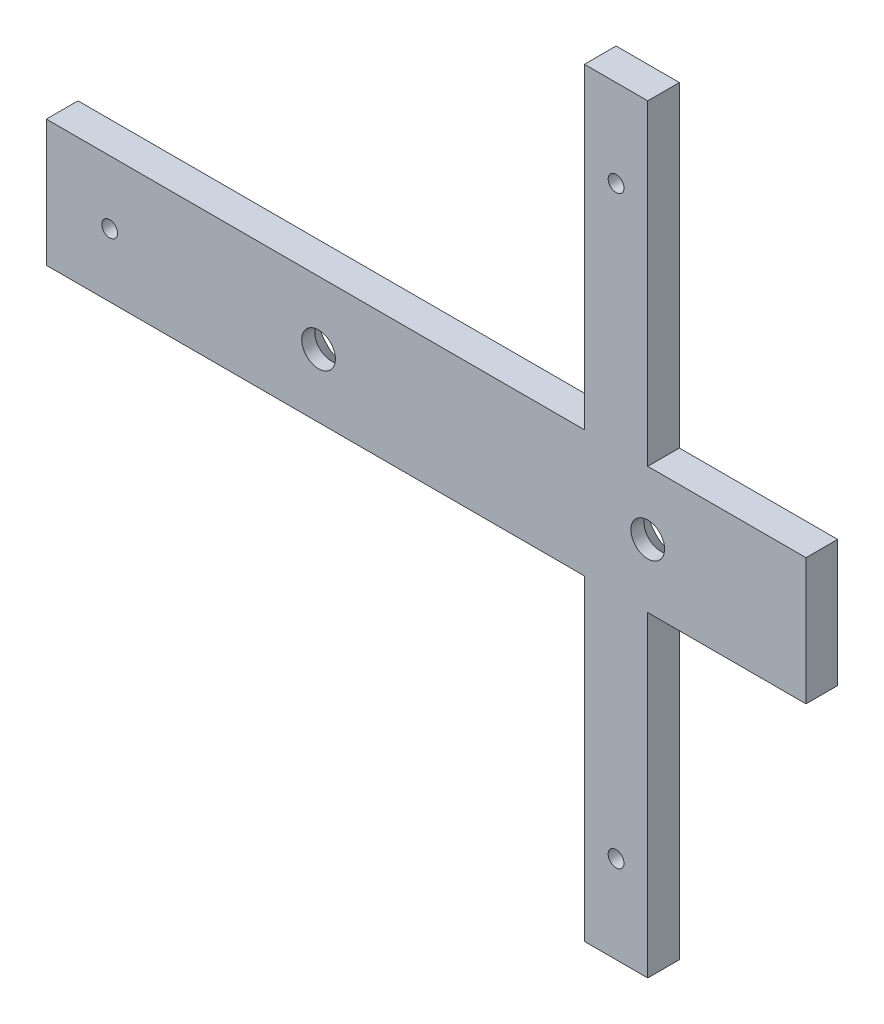
ISO-10303-21;
HEADER;
FILE_DESCRIPTION(('STEP AP214'),'2;1');
FILE_NAME('part.step','',(''),(''),'','','');
FILE_SCHEMA(('AUTOMOTIVE_DESIGN { 1 0 10303 214 1 1 1 1 }'));
ENDSEC;
DATA;
#1=APPLICATION_CONTEXT('core data for automotive mechanical design processes');
#2=APPLICATION_PROTOCOL_DEFINITION('international standard','automotive_design',2000,#1);
#3=PRODUCT_CONTEXT('',#1,'mechanical');
#4=PRODUCT('Part','Part','',(#3));
#5=PRODUCT_RELATED_PRODUCT_CATEGORY('part','',(#4));
#6=PRODUCT_DEFINITION_FORMATION('','',#4);
#7=PRODUCT_DEFINITION_CONTEXT('part definition',#1,'design');
#8=PRODUCT_DEFINITION('design','',#6,#7);
#9=PRODUCT_DEFINITION_SHAPE('','',#8);
#10=(LENGTH_UNIT() NAMED_UNIT(*) SI_UNIT(.MILLI.,.METRE.));
#11=(NAMED_UNIT(*) PLANE_ANGLE_UNIT() SI_UNIT($,.RADIAN.));
#12=(NAMED_UNIT(*) SI_UNIT($,.STERADIAN.) SOLID_ANGLE_UNIT());
#13=UNCERTAINTY_MEASURE_WITH_UNIT(LENGTH_MEASURE(1.E-05),#10,'distance_accuracy_value','');
#14=(GEOMETRIC_REPRESENTATION_CONTEXT(3) GLOBAL_UNCERTAINTY_ASSIGNED_CONTEXT((#13)) GLOBAL_UNIT_ASSIGNED_CONTEXT((#10,
#11,#12)) REPRESENTATION_CONTEXT('',''));
#15=CARTESIAN_POINT('',(0.,0.,0.));
#16=DIRECTION('',(0.,0.,1.));
#17=DIRECTION('',(1.,0.,0.));
#18=AXIS2_PLACEMENT_3D('',#15,#16,#17);
#19=CARTESIAN_POINT('',(-76.2,-76.2,6.35));
#20=DIRECTION('',(0.,0.,1.));
#21=DIRECTION('',(1.,0.,0.));
#22=AXIS2_PLACEMENT_3D('',#19,#20,#21);
#23=PLANE('',#22);
#24=DIRECTION('',(0.,-1.,0.));
#25=VECTOR('',#24,1.);
#26=CARTESIAN_POINT('',(31.75,12.7,6.35));
#27=LINE('',#26,#25);
#28=CARTESIAN_POINT('',(31.75,76.2,6.35));
#29=VERTEX_POINT('',#28);
#30=CARTESIAN_POINT('',(31.75,12.7,6.35));
#31=VERTEX_POINT('',#30);
#32=EDGE_CURVE('E206',#29,#31,#27,.T.);
#33=ORIENTED_EDGE('',*,*,#32,.T.);
#34=DIRECTION('',(-1.,0.,0.));
#35=VECTOR('',#34,1.);
#36=CARTESIAN_POINT('',(-76.2,12.7,6.35));
#37=LINE('',#36,#35);
#38=CARTESIAN_POINT('',(-76.2,12.7,6.35));
#39=VERTEX_POINT('',#38);
#40=EDGE_CURVE('E203',#31,#39,#37,.T.);
#41=ORIENTED_EDGE('',*,*,#40,.T.);
#42=DIRECTION('',(0.,-1.,0.));
#43=VECTOR('',#42,1.);
#44=CARTESIAN_POINT('',(-76.2,76.2,6.35));
#45=LINE('',#44,#43);
#46=CARTESIAN_POINT('',(-76.2,-12.7,6.35));
#47=VERTEX_POINT('',#46);
#48=EDGE_CURVE('E161',#39,#47,#45,.T.);
#49=ORIENTED_EDGE('',*,*,#48,.T.);
#50=DIRECTION('',(1.,0.,0.));
#51=VECTOR('',#50,1.);
#52=CARTESIAN_POINT('',(31.75,-12.7,6.35));
#53=LINE('',#52,#51);
#54=CARTESIAN_POINT('',(31.75,-12.7,6.35));
#55=VERTEX_POINT('',#54);
#56=EDGE_CURVE('E223',#47,#55,#53,.T.);
#57=ORIENTED_EDGE('',*,*,#56,.T.);
#58=DIRECTION('',(0.,-1.,0.));
#59=VECTOR('',#58,1.);
#60=CARTESIAN_POINT('',(31.75,-76.2,6.35));
#61=LINE('',#60,#59);
#62=CARTESIAN_POINT('',(31.75,-76.2,6.35));
#63=VERTEX_POINT('',#62);
#64=EDGE_CURVE('E221',#55,#63,#61,.T.);
#65=ORIENTED_EDGE('',*,*,#64,.T.);
#66=DIRECTION('',(1.,0.,0.));
#67=VECTOR('',#66,1.);
#68=CARTESIAN_POINT('',(-76.2,-76.2,6.35));
#69=LINE('',#68,#67);
#70=CARTESIAN_POINT('',(44.45,-76.2,6.35));
#71=VERTEX_POINT('',#70);
#72=EDGE_CURVE('E144',#63,#71,#69,.T.);
#73=ORIENTED_EDGE('',*,*,#72,.T.);
#74=DIRECTION('',(0.,1.,0.));
#75=VECTOR('',#74,1.);
#76=CARTESIAN_POINT('',(44.45,-12.7,6.35));
#77=LINE('',#76,#75);
#78=CARTESIAN_POINT('',(44.45,-12.7,6.35));
#79=VERTEX_POINT('',#78);
#80=EDGE_CURVE('E218',#71,#79,#77,.T.);
#81=ORIENTED_EDGE('',*,*,#80,.T.);
#82=DIRECTION('',(1.,0.,0.));
#83=VECTOR('',#82,1.);
#84=CARTESIAN_POINT('',(76.2,-12.7,6.35));
#85=LINE('',#84,#83);
#86=CARTESIAN_POINT('',(76.2,-12.7,6.35));
#87=VERTEX_POINT('',#86);
#88=EDGE_CURVE('E215',#79,#87,#85,.T.);
#89=ORIENTED_EDGE('',*,*,#88,.T.);
#90=DIRECTION('',(0.,1.,0.));
#91=VECTOR('',#90,1.);
#92=CARTESIAN_POINT('',(76.2,76.2,6.35));
#93=LINE('',#92,#91);
#94=CARTESIAN_POINT('',(76.2,12.7,6.35));
#95=VERTEX_POINT('',#94);
#96=EDGE_CURVE('E41',#87,#95,#93,.T.);
#97=ORIENTED_EDGE('',*,*,#96,.T.);
#98=DIRECTION('',(-1.,0.,0.));
#99=VECTOR('',#98,1.);
#100=CARTESIAN_POINT('',(44.45,12.7,6.35));
#101=LINE('',#100,#99);
#102=CARTESIAN_POINT('',(44.45,12.7,6.35));
#103=VERTEX_POINT('',#102);
#104=EDGE_CURVE('E212',#95,#103,#101,.T.);
#105=ORIENTED_EDGE('',*,*,#104,.T.);
#106=DIRECTION('',(0.,1.,0.));
#107=VECTOR('',#106,1.);
#108=CARTESIAN_POINT('',(44.45,76.2,6.35));
#109=LINE('',#108,#107);
#110=CARTESIAN_POINT('',(44.45,76.2,6.35));
#111=VERTEX_POINT('',#110);
#112=EDGE_CURVE('E209',#103,#111,#109,.T.);
#113=ORIENTED_EDGE('',*,*,#112,.T.);
#114=DIRECTION('',(-1.,0.,0.));
#115=VECTOR('',#114,1.);
#116=CARTESIAN_POINT('',(-76.2,76.2,6.35));
#117=LINE('',#116,#115);
#118=EDGE_CURVE('E12',#111,#29,#117,.T.);
#119=ORIENTED_EDGE('',*,*,#118,.T.);
#120=EDGE_LOOP('',(#33,#41,#49,#57,#65,#73,#81,#89,#97,#105,#113,#119));
#121=FACE_BOUND('',#120,.T.);
#122=CARTESIAN_POINT('',(-63.5,0.,6.35));
#123=DIRECTION('',(0.,0.,1.));
#124=DIRECTION('',(1.,0.,0.));
#125=AXIS2_PLACEMENT_3D('',#122,#123,#124);
#126=CIRCLE('',#125,1.5875);
#127=CARTESIAN_POINT('',(-61.9125,0.,6.35));
#128=VERTEX_POINT('',#127);
#129=EDGE_CURVE('E164',#128,#128,#126,.T.);
#130=ORIENTED_EDGE('',*,*,#129,.F.);
#131=EDGE_LOOP('',(#130));
#132=FACE_BOUND('',#131,.T.);
#133=CARTESIAN_POINT('',(38.1,58.6587873496662,6.35));
#134=DIRECTION('',(0.,0.,1.));
#135=DIRECTION('',(1.,0.,0.));
#136=AXIS2_PLACEMENT_3D('',#133,#134,#135);
#137=CIRCLE('',#136,1.5875);
#138=CARTESIAN_POINT('',(39.6875,58.6587873496662,6.35));
#139=VERTEX_POINT('',#138);
#140=EDGE_CURVE('E170',#139,#139,#137,.T.);
#141=ORIENTED_EDGE('',*,*,#140,.F.);
#142=EDGE_LOOP('',(#141));
#143=FACE_BOUND('',#142,.T.);
#144=CARTESIAN_POINT('',(38.1,-58.6587873496684,6.35));
#145=DIRECTION('',(0.,0.,1.));
#146=DIRECTION('',(1.,0.,0.));
#147=AXIS2_PLACEMENT_3D('',#144,#145,#146);
#148=CIRCLE('',#147,1.5875);
#149=CARTESIAN_POINT('',(39.6875,-58.6587873496684,6.35));
#150=VERTEX_POINT('',#149);
#151=EDGE_CURVE('E176',#150,#150,#148,.T.);
#152=ORIENTED_EDGE('',*,*,#151,.F.);
#153=EDGE_LOOP('',(#152));
#154=FACE_BOUND('',#153,.T.);
#155=CARTESIAN_POINT('',(-21.59,0.,6.34999999999999));
#156=DIRECTION('',(0.,0.,-1.));
#157=DIRECTION('',(-1.,0.,0.));
#158=AXIS2_PLACEMENT_3D('',#155,#156,#157);
#159=CIRCLE('',#158,3.37819999999998);
#160=CARTESIAN_POINT('',(-24.9682,0.,6.34999999999999));
#161=VERTEX_POINT('',#160);
#162=EDGE_CURVE('E226',#161,#161,#159,.T.);
#163=ORIENTED_EDGE('',*,*,#162,.T.);
#164=EDGE_LOOP('',(#163));
#165=FACE_BOUND('',#164,.T.);
#166=CARTESIAN_POINT('',(44.45,0.,6.34999999999999));
#167=DIRECTION('',(0.,0.,-1.));
#168=DIRECTION('',(-1.,0.,0.));
#169=AXIS2_PLACEMENT_3D('',#166,#167,#168);
#170=CIRCLE('',#169,3.37819999999998);
#171=CARTESIAN_POINT('',(41.0718,0.,6.34999999999999));
#172=VERTEX_POINT('',#171);
#173=EDGE_CURVE('E247',#172,#172,#170,.T.);
#174=ORIENTED_EDGE('',*,*,#173,.T.);
#175=EDGE_LOOP('',(#174));
#176=FACE_BOUND('',#175,.T.);
#177=ADVANCED_FACE('F32',(#121,#132,#143,#154,#165,#176),#23,.T.);
#178=CARTESIAN_POINT('',(-76.2,-76.2,0.));
#179=DIRECTION('',(0.,0.,1.));
#180=DIRECTION('',(1.,0.,0.));
#181=AXIS2_PLACEMENT_3D('',#178,#179,#180);
#182=PLANE('',#181);
#183=CARTESIAN_POINT('',(-21.59,0.,0.));
#184=DIRECTION('',(0.,0.,-1.));
#185=DIRECTION('',(-1.,0.,0.));
#186=AXIS2_PLACEMENT_3D('',#183,#184,#185);
#187=CIRCLE('',#186,6.61924);
#188=CARTESIAN_POINT('',(-28.20924,0.,0.));
#189=VERTEX_POINT('',#188);
#190=EDGE_CURVE('E244',#189,#189,#187,.T.);
#191=ORIENTED_EDGE('',*,*,#190,.F.);
#192=EDGE_LOOP('',(#191));
#193=FACE_BOUND('',#192,.T.);
#194=CARTESIAN_POINT('',(38.1,-58.6587873496684,0.));
#195=DIRECTION('',(0.,0.,1.));
#196=DIRECTION('',(1.,0.,0.));
#197=AXIS2_PLACEMENT_3D('',#194,#195,#196);
#198=CIRCLE('',#197,1.5875);
#199=CARTESIAN_POINT('',(39.6875,-58.6587873496684,0.));
#200=VERTEX_POINT('',#199);
#201=EDGE_CURVE('E173',#200,#200,#198,.T.);
#202=ORIENTED_EDGE('',*,*,#201,.T.);
#203=EDGE_LOOP('',(#202));
#204=FACE_BOUND('',#203,.T.);
#205=CARTESIAN_POINT('',(38.1,58.6587873496662,0.));
#206=DIRECTION('',(0.,0.,1.));
#207=DIRECTION('',(1.,0.,0.));
#208=AXIS2_PLACEMENT_3D('',#205,#206,#207);
#209=CIRCLE('',#208,1.5875);
#210=CARTESIAN_POINT('',(39.6875,58.6587873496662,0.));
#211=VERTEX_POINT('',#210);
#212=EDGE_CURVE('E167',#211,#211,#209,.T.);
#213=ORIENTED_EDGE('',*,*,#212,.T.);
#214=EDGE_LOOP('',(#213));
#215=FACE_BOUND('',#214,.T.);
#216=CARTESIAN_POINT('',(-63.5,0.,0.));
#217=DIRECTION('',(0.,0.,1.));
#218=DIRECTION('',(1.,0.,0.));
#219=AXIS2_PLACEMENT_3D('',#216,#217,#218);
#220=CIRCLE('',#219,1.5875);
#221=CARTESIAN_POINT('',(-61.9125,0.,0.));
#222=VERTEX_POINT('',#221);
#223=EDGE_CURVE('E155',#222,#222,#220,.T.);
#224=ORIENTED_EDGE('',*,*,#223,.T.);
#225=EDGE_LOOP('',(#224));
#226=FACE_BOUND('',#225,.T.);
#227=DIRECTION('',(-1.,0.,0.));
#228=VECTOR('',#227,1.);
#229=CARTESIAN_POINT('',(-76.2,12.7,0.));
#230=LINE('',#229,#228);
#231=CARTESIAN_POINT('',(31.75,12.7,0.));
#232=VERTEX_POINT('',#231);
#233=CARTESIAN_POINT('',(-76.2,12.7,0.));
#234=VERTEX_POINT('',#233);
#235=EDGE_CURVE('E185',#232,#234,#230,.T.);
#236=ORIENTED_EDGE('',*,*,#235,.F.);
#237=DIRECTION('',(0.,-1.,0.));
#238=VECTOR('',#237,1.);
#239=CARTESIAN_POINT('',(31.75,12.7,0.));
#240=LINE('',#239,#238);
#241=CARTESIAN_POINT('',(31.75,76.2,0.));
#242=VERTEX_POINT('',#241);
#243=EDGE_CURVE('E228',#242,#232,#240,.T.);
#244=ORIENTED_EDGE('',*,*,#243,.F.);
#245=DIRECTION('',(-1.,0.,0.));
#246=VECTOR('',#245,1.);
#247=CARTESIAN_POINT('',(-76.2,76.2,0.));
#248=LINE('',#247,#246);
#249=CARTESIAN_POINT('',(44.45,76.2,0.));
#250=VERTEX_POINT('',#249);
#251=EDGE_CURVE('E36',#250,#242,#248,.T.);
#252=ORIENTED_EDGE('',*,*,#251,.F.);
#253=DIRECTION('',(0.,1.,0.));
#254=VECTOR('',#253,1.);
#255=CARTESIAN_POINT('',(44.45,76.2,0.));
#256=LINE('',#255,#254);
#257=CARTESIAN_POINT('',(44.45,12.7,0.));
#258=VERTEX_POINT('',#257);
#259=EDGE_CURVE('E231',#258,#250,#256,.T.);
#260=ORIENTED_EDGE('',*,*,#259,.F.);
#261=DIRECTION('',(-1.,0.,0.));
#262=VECTOR('',#261,1.);
#263=CARTESIAN_POINT('',(44.45,12.7,0.));
#264=LINE('',#263,#262);
#265=CARTESIAN_POINT('',(76.2,12.7,0.));
#266=VERTEX_POINT('',#265);
#267=EDGE_CURVE('E233',#266,#258,#264,.T.);
#268=ORIENTED_EDGE('',*,*,#267,.F.);
#269=DIRECTION('',(0.,1.,0.));
#270=VECTOR('',#269,1.);
#271=CARTESIAN_POINT('',(76.2,76.2,0.));
#272=LINE('',#271,#270);
#273=CARTESIAN_POINT('',(76.2,-12.7,0.));
#274=VERTEX_POINT('',#273);
#275=EDGE_CURVE('E150',#274,#266,#272,.T.);
#276=ORIENTED_EDGE('',*,*,#275,.F.);
#277=DIRECTION('',(1.,0.,0.));
#278=VECTOR('',#277,1.);
#279=CARTESIAN_POINT('',(76.2,-12.7,0.));
#280=LINE('',#279,#278);
#281=CARTESIAN_POINT('',(44.45,-12.7,0.));
#282=VERTEX_POINT('',#281);
#283=EDGE_CURVE('E235',#282,#274,#280,.T.);
#284=ORIENTED_EDGE('',*,*,#283,.F.);
#285=DIRECTION('',(0.,1.,0.));
#286=VECTOR('',#285,1.);
#287=CARTESIAN_POINT('',(44.45,-12.7,0.));
#288=LINE('',#287,#286);
#289=CARTESIAN_POINT('',(44.45,-76.2,0.));
#290=VERTEX_POINT('',#289);
#291=EDGE_CURVE('E135',#290,#282,#288,.T.);
#292=ORIENTED_EDGE('',*,*,#291,.F.);
#293=DIRECTION('',(1.,0.,0.));
#294=VECTOR('',#293,1.);
#295=CARTESIAN_POINT('',(-76.2,-76.2,0.));
#296=LINE('',#295,#294);
#297=CARTESIAN_POINT('',(31.75,-76.2,0.));
#298=VERTEX_POINT('',#297);
#299=EDGE_CURVE('E142',#298,#290,#296,.T.);
#300=ORIENTED_EDGE('',*,*,#299,.F.);
#301=DIRECTION('',(0.,-1.,0.));
#302=VECTOR('',#301,1.);
#303=CARTESIAN_POINT('',(31.75,-76.2,0.));
#304=LINE('',#303,#302);
#305=CARTESIAN_POINT('',(31.75,-12.7,0.));
#306=VERTEX_POINT('',#305);
#307=EDGE_CURVE('E124',#306,#298,#304,.T.);
#308=ORIENTED_EDGE('',*,*,#307,.F.);
#309=DIRECTION('',(1.,0.,0.));
#310=VECTOR('',#309,1.);
#311=CARTESIAN_POINT('',(31.75,-12.7,0.));
#312=LINE('',#311,#310);
#313=CARTESIAN_POINT('',(-76.2,-12.7,0.));
#314=VERTEX_POINT('',#313);
#315=EDGE_CURVE('E136',#314,#306,#312,.T.);
#316=ORIENTED_EDGE('',*,*,#315,.F.);
#317=DIRECTION('',(0.,-1.,0.));
#318=VECTOR('',#317,1.);
#319=CARTESIAN_POINT('',(-76.2,76.2,0.));
#320=LINE('',#319,#318);
#321=EDGE_CURVE('E151',#234,#314,#320,.T.);
#322=ORIENTED_EDGE('',*,*,#321,.F.);
#323=EDGE_LOOP('',(#236,#244,#252,#260,#268,#276,#284,#292,#300,#308,#316,#322));
#324=FACE_BOUND('',#323,.T.);
#325=CARTESIAN_POINT('',(44.45,0.,0.));
#326=DIRECTION('',(0.,0.,-1.));
#327=DIRECTION('',(-1.,0.,0.));
#328=AXIS2_PLACEMENT_3D('',#325,#326,#327);
#329=CIRCLE('',#328,6.61924);
#330=CARTESIAN_POINT('',(37.83076,0.,0.));
#331=VERTEX_POINT('',#330);
#332=EDGE_CURVE('E253',#331,#331,#329,.T.);
#333=ORIENTED_EDGE('',*,*,#332,.F.);
#334=EDGE_LOOP('',(#333));
#335=FACE_BOUND('',#334,.T.);
#336=ADVANCED_FACE('F147',(#193,#204,#215,#226,#324,#335),#182,.F.);
#337=CARTESIAN_POINT('',(-76.2,76.2,6.35));
#338=DIRECTION('',(1.,0.,0.));
#339=DIRECTION('',(0.,0.,-1.));
#340=AXIS2_PLACEMENT_3D('',#337,#338,#339);
#341=PLANE('',#340);
#342=DIRECTION('',(0.,0.,1.));
#343=VECTOR('',#342,1.);
#344=CARTESIAN_POINT('',(-76.2,12.7,0.));
#345=LINE('',#344,#343);
#346=EDGE_CURVE('E179',#234,#39,#345,.T.);
#347=ORIENTED_EDGE('',*,*,#346,.F.);
#348=ORIENTED_EDGE('',*,*,#321,.T.);
#349=DIRECTION('',(0.,0.,1.));
#350=VECTOR('',#349,1.);
#351=CARTESIAN_POINT('',(-76.2,-12.7,0.));
#352=LINE('',#351,#350);
#353=EDGE_CURVE('E182',#314,#47,#352,.T.);
#354=ORIENTED_EDGE('',*,*,#353,.T.);
#355=ORIENTED_EDGE('',*,*,#48,.F.);
#356=EDGE_LOOP('',(#347,#348,#354,#355));
#357=FACE_BOUND('',#356,.T.);
#358=ADVANCED_FACE('F34',(#357),#341,.F.);
#359=CARTESIAN_POINT('',(-76.2,-76.2,6.35));
#360=DIRECTION('',(0.,1.,0.));
#361=DIRECTION('',(0.,0.,1.));
#362=AXIS2_PLACEMENT_3D('',#359,#360,#361);
#363=PLANE('',#362);
#364=DIRECTION('',(0.,0.,1.));
#365=VECTOR('',#364,1.);
#366=CARTESIAN_POINT('',(44.45,-76.2,0.));
#367=LINE('',#366,#365);
#368=EDGE_CURVE('E49',#290,#71,#367,.T.);
#369=ORIENTED_EDGE('',*,*,#368,.T.);
#370=ORIENTED_EDGE('',*,*,#72,.F.);
#371=DIRECTION('',(0.,0.,1.));
#372=VECTOR('',#371,1.);
#373=CARTESIAN_POINT('',(31.75,-76.2,0.));
#374=LINE('',#373,#372);
#375=EDGE_CURVE('E128',#298,#63,#374,.T.);
#376=ORIENTED_EDGE('',*,*,#375,.F.);
#377=ORIENTED_EDGE('',*,*,#299,.T.);
#378=EDGE_LOOP('',(#369,#370,#376,#377));
#379=FACE_BOUND('',#378,.T.);
#380=ADVANCED_FACE('F141',(#379),#363,.F.);
#381=CARTESIAN_POINT('',(76.2,76.2,6.35));
#382=DIRECTION('',(-1.,0.,0.));
#383=DIRECTION('',(0.,-1.,0.));
#384=AXIS2_PLACEMENT_3D('',#381,#382,#383);
#385=PLANE('',#384);
#386=DIRECTION('',(0.,0.,1.));
#387=VECTOR('',#386,1.);
#388=CARTESIAN_POINT('',(76.2,12.7,0.));
#389=LINE('',#388,#387);
#390=EDGE_CURVE('E57',#266,#95,#389,.T.);
#391=ORIENTED_EDGE('',*,*,#390,.T.);
#392=ORIENTED_EDGE('',*,*,#96,.F.);
#393=DIRECTION('',(0.,0.,1.));
#394=VECTOR('',#393,1.);
#395=CARTESIAN_POINT('',(76.2,-12.7,0.));
#396=LINE('',#395,#394);
#397=EDGE_CURVE('E190',#274,#87,#396,.T.);
#398=ORIENTED_EDGE('',*,*,#397,.F.);
#399=ORIENTED_EDGE('',*,*,#275,.T.);
#400=EDGE_LOOP('',(#391,#392,#398,#399));
#401=FACE_BOUND('',#400,.T.);
#402=ADVANCED_FACE('F276',(#401),#385,.F.);
#403=CARTESIAN_POINT('',(-76.2,76.2,6.35));
#404=DIRECTION('',(0.,-1.,0.));
#405=DIRECTION('',(0.,0.,-1.));
#406=AXIS2_PLACEMENT_3D('',#403,#404,#405);
#407=PLANE('',#406);
#408=DIRECTION('',(0.,0.,1.));
#409=VECTOR('',#408,1.);
#410=CARTESIAN_POINT('',(31.75,76.2,0.));
#411=LINE('',#410,#409);
#412=EDGE_CURVE('E197',#242,#29,#411,.T.);
#413=ORIENTED_EDGE('',*,*,#412,.T.);
#414=ORIENTED_EDGE('',*,*,#118,.F.);
#415=DIRECTION('',(0.,0.,1.));
#416=VECTOR('',#415,1.);
#417=CARTESIAN_POINT('',(44.45,76.2,0.));
#418=LINE('',#417,#416);
#419=EDGE_CURVE('E195',#250,#111,#418,.T.);
#420=ORIENTED_EDGE('',*,*,#419,.F.);
#421=ORIENTED_EDGE('',*,*,#251,.T.);
#422=EDGE_LOOP('',(#413,#414,#420,#421));
#423=FACE_BOUND('',#422,.T.);
#424=ADVANCED_FACE('F272',(#423),#407,.F.);
#425=CARTESIAN_POINT('',(-63.5,0.,0.));
#426=DIRECTION('',(0.,0.,1.));
#427=DIRECTION('',(1.,0.,0.));
#428=AXIS2_PLACEMENT_3D('',#425,#426,#427);
#429=CYLINDRICAL_SURFACE('',#428,1.5875);
#430=ORIENTED_EDGE('',*,*,#223,.F.);
#431=EDGE_LOOP('',(#430));
#432=FACE_BOUND('',#431,.T.);
#433=ORIENTED_EDGE('',*,*,#129,.T.);
#434=EDGE_LOOP('',(#433));
#435=FACE_BOUND('',#434,.T.);
#436=ADVANCED_FACE('F275',(#432,#435),#429,.F.);
#437=CARTESIAN_POINT('',(38.1,58.6587873496662,0.));
#438=DIRECTION('',(0.,0.,1.));
#439=DIRECTION('',(1.,0.,0.));
#440=AXIS2_PLACEMENT_3D('',#437,#438,#439);
#441=CYLINDRICAL_SURFACE('',#440,1.5875);
#442=ORIENTED_EDGE('',*,*,#212,.F.);
#443=EDGE_LOOP('',(#442));
#444=FACE_BOUND('',#443,.T.);
#445=ORIENTED_EDGE('',*,*,#140,.T.);
#446=EDGE_LOOP('',(#445));
#447=FACE_BOUND('',#446,.T.);
#448=ADVANCED_FACE('F300',(#444,#447),#441,.F.);
#449=CARTESIAN_POINT('',(38.1,-58.6587873496684,0.));
#450=DIRECTION('',(0.,0.,1.));
#451=DIRECTION('',(1.,0.,0.));
#452=AXIS2_PLACEMENT_3D('',#449,#450,#451);
#453=CYLINDRICAL_SURFACE('',#452,1.5875);
#454=ORIENTED_EDGE('',*,*,#201,.F.);
#455=EDGE_LOOP('',(#454));
#456=FACE_BOUND('',#455,.T.);
#457=ORIENTED_EDGE('',*,*,#151,.T.);
#458=EDGE_LOOP('',(#457));
#459=FACE_BOUND('',#458,.T.);
#460=ADVANCED_FACE('F307',(#456,#459),#453,.F.);
#461=CARTESIAN_POINT('',(31.75,-12.7,0.));
#462=DIRECTION('',(0.,-1.,0.));
#463=DIRECTION('',(1.,0.,0.));
#464=AXIS2_PLACEMENT_3D('',#461,#462,#463);
#465=PLANE('',#464);
#466=ORIENTED_EDGE('',*,*,#56,.F.);
#467=ORIENTED_EDGE('',*,*,#353,.F.);
#468=ORIENTED_EDGE('',*,*,#315,.T.);
#469=DIRECTION('',(0.,0.,1.));
#470=VECTOR('',#469,1.);
#471=CARTESIAN_POINT('',(31.75,-12.7,0.));
#472=LINE('',#471,#470);
#473=EDGE_CURVE('E130',#306,#55,#472,.T.);
#474=ORIENTED_EDGE('',*,*,#473,.T.);
#475=EDGE_LOOP('',(#466,#467,#468,#474));
#476=FACE_BOUND('',#475,.T.);
#477=ADVANCED_FACE('F315',(#476),#465,.T.);
#478=CARTESIAN_POINT('',(31.75,-76.2,0.));
#479=DIRECTION('',(-1.,0.,0.));
#480=DIRECTION('',(0.,0.,1.));
#481=AXIS2_PLACEMENT_3D('',#478,#479,#480);
#482=PLANE('',#481);
#483=ORIENTED_EDGE('',*,*,#64,.F.);
#484=ORIENTED_EDGE('',*,*,#473,.F.);
#485=ORIENTED_EDGE('',*,*,#307,.T.);
#486=ORIENTED_EDGE('',*,*,#375,.T.);
#487=EDGE_LOOP('',(#483,#484,#485,#486));
#488=FACE_BOUND('',#487,.T.);
#489=ADVANCED_FACE('F127',(#488),#482,.T.);
#490=CARTESIAN_POINT('',(44.45,-12.7,0.));
#491=DIRECTION('',(1.,0.,0.));
#492=DIRECTION('',(0.,1.,0.));
#493=AXIS2_PLACEMENT_3D('',#490,#491,#492);
#494=PLANE('',#493);
#495=ORIENTED_EDGE('',*,*,#80,.F.);
#496=ORIENTED_EDGE('',*,*,#368,.F.);
#497=ORIENTED_EDGE('',*,*,#291,.T.);
#498=DIRECTION('',(0.,0.,1.));
#499=VECTOR('',#498,1.);
#500=CARTESIAN_POINT('',(44.45,-12.7,0.));
#501=LINE('',#500,#499);
#502=EDGE_CURVE('E188',#282,#79,#501,.T.);
#503=ORIENTED_EDGE('',*,*,#502,.T.);
#504=EDGE_LOOP('',(#495,#496,#497,#503));
#505=FACE_BOUND('',#504,.T.);
#506=ADVANCED_FACE('F329',(#505),#494,.T.);
#507=CARTESIAN_POINT('',(76.2,-12.7,0.));
#508=DIRECTION('',(0.,-1.,0.));
#509=DIRECTION('',(1.,0.,0.));
#510=AXIS2_PLACEMENT_3D('',#507,#508,#509);
#511=PLANE('',#510);
#512=ORIENTED_EDGE('',*,*,#88,.F.);
#513=ORIENTED_EDGE('',*,*,#502,.F.);
#514=ORIENTED_EDGE('',*,*,#283,.T.);
#515=ORIENTED_EDGE('',*,*,#397,.T.);
#516=EDGE_LOOP('',(#512,#513,#514,#515));
#517=FACE_BOUND('',#516,.T.);
#518=ADVANCED_FACE('F336',(#517),#511,.T.);
#519=CARTESIAN_POINT('',(44.45,12.7,0.));
#520=DIRECTION('',(0.,1.,0.));
#521=DIRECTION('',(0.,0.,1.));
#522=AXIS2_PLACEMENT_3D('',#519,#520,#521);
#523=PLANE('',#522);
#524=ORIENTED_EDGE('',*,*,#104,.F.);
#525=ORIENTED_EDGE('',*,*,#390,.F.);
#526=ORIENTED_EDGE('',*,*,#267,.T.);
#527=DIRECTION('',(0.,0.,1.));
#528=VECTOR('',#527,1.);
#529=CARTESIAN_POINT('',(44.45,12.7,0.));
#530=LINE('',#529,#528);
#531=EDGE_CURVE('E193',#258,#103,#530,.T.);
#532=ORIENTED_EDGE('',*,*,#531,.T.);
#533=EDGE_LOOP('',(#524,#525,#526,#532));
#534=FACE_BOUND('',#533,.T.);
#535=ADVANCED_FACE('F343',(#534),#523,.T.);
#536=CARTESIAN_POINT('',(44.45,76.2,0.));
#537=DIRECTION('',(1.,0.,0.));
#538=DIRECTION('',(0.,1.,0.));
#539=AXIS2_PLACEMENT_3D('',#536,#537,#538);
#540=PLANE('',#539);
#541=ORIENTED_EDGE('',*,*,#112,.F.);
#542=ORIENTED_EDGE('',*,*,#531,.F.);
#543=ORIENTED_EDGE('',*,*,#259,.T.);
#544=ORIENTED_EDGE('',*,*,#419,.T.);
#545=EDGE_LOOP('',(#541,#542,#543,#544));
#546=FACE_BOUND('',#545,.T.);
#547=ADVANCED_FACE('F351',(#546),#540,.T.);
#548=CARTESIAN_POINT('',(-76.2,12.7,0.));
#549=DIRECTION('',(0.,1.,0.));
#550=DIRECTION('',(-1.,0.,0.));
#551=AXIS2_PLACEMENT_3D('',#548,#549,#550);
#552=PLANE('',#551);
#553=ORIENTED_EDGE('',*,*,#40,.F.);
#554=DIRECTION('',(0.,0.,1.));
#555=VECTOR('',#554,1.);
#556=CARTESIAN_POINT('',(31.75,12.7,0.));
#557=LINE('',#556,#555);
#558=EDGE_CURVE('E200',#232,#31,#557,.T.);
#559=ORIENTED_EDGE('',*,*,#558,.F.);
#560=ORIENTED_EDGE('',*,*,#235,.T.);
#561=ORIENTED_EDGE('',*,*,#346,.T.);
#562=EDGE_LOOP('',(#553,#559,#560,#561));
#563=FACE_BOUND('',#562,.T.);
#564=ADVANCED_FACE('F358',(#563),#552,.T.);
#565=CARTESIAN_POINT('',(31.75,12.7,0.));
#566=DIRECTION('',(-1.,0.,0.));
#567=DIRECTION('',(0.,0.,1.));
#568=AXIS2_PLACEMENT_3D('',#565,#566,#567);
#569=PLANE('',#568);
#570=ORIENTED_EDGE('',*,*,#32,.F.);
#571=ORIENTED_EDGE('',*,*,#412,.F.);
#572=ORIENTED_EDGE('',*,*,#243,.T.);
#573=ORIENTED_EDGE('',*,*,#558,.T.);
#574=EDGE_LOOP('',(#570,#571,#572,#573));
#575=FACE_BOUND('',#574,.T.);
#576=ADVANCED_FACE('F366',(#575),#569,.T.);
#577=CARTESIAN_POINT('',(-21.59,0.,0.));
#578=DIRECTION('',(0.,0.,-1.));
#579=DIRECTION('',(-1.,0.,0.));
#580=AXIS2_PLACEMENT_3D('',#577,#578,#579);
#581=CYLINDRICAL_SURFACE('',#580,3.37819999999998);
#582=ORIENTED_EDGE('',*,*,#162,.F.);
#583=EDGE_LOOP('',(#582));
#584=FACE_BOUND('',#583,.T.);
#585=CARTESIAN_POINT('',(-21.59,0.,3.72839002253957));
#586=DIRECTION('',(0.,0.,-1.));
#587=DIRECTION('',(-1.,0.,0.));
#588=AXIS2_PLACEMENT_3D('',#585,#586,#587);
#589=CIRCLE('',#588,3.37819999999999);
#590=CARTESIAN_POINT('',(-24.9682,0.,3.72839002253957));
#591=VERTEX_POINT('',#590);
#592=EDGE_CURVE('E241',#591,#591,#589,.T.);
#593=ORIENTED_EDGE('',*,*,#592,.T.);
#594=EDGE_LOOP('',(#593));
#595=FACE_BOUND('',#594,.T.);
#596=ADVANCED_FACE('F374',(#584,#595),#581,.F.);
#597=CARTESIAN_POINT('',(-21.59,0.,0.));
#598=DIRECTION('',(0.,0.,-1.));
#599=DIRECTION('',(-1.,0.,0.));
#600=AXIS2_PLACEMENT_3D('',#597,#598,#599);
#601=CONICAL_SURFACE('',#600,6.61924,0.715584993317675);
#602=ORIENTED_EDGE('',*,*,#592,.F.);
#603=EDGE_LOOP('',(#602));
#604=FACE_BOUND('',#603,.T.);
#605=ORIENTED_EDGE('',*,*,#190,.T.);
#606=EDGE_LOOP('',(#605));
#607=FACE_BOUND('',#606,.T.);
#608=ADVANCED_FACE('F382',(#604,#607),#601,.F.);
#609=CARTESIAN_POINT('',(44.45,0.,0.));
#610=DIRECTION('',(0.,0.,-1.));
#611=DIRECTION('',(-1.,0.,0.));
#612=AXIS2_PLACEMENT_3D('',#609,#610,#611);
#613=CYLINDRICAL_SURFACE('',#612,3.37819999999998);
#614=ORIENTED_EDGE('',*,*,#173,.F.);
#615=EDGE_LOOP('',(#614));
#616=FACE_BOUND('',#615,.T.);
#617=CARTESIAN_POINT('',(44.45,0.,3.72839002253957));
#618=DIRECTION('',(0.,0.,-1.));
#619=DIRECTION('',(-1.,0.,0.));
#620=AXIS2_PLACEMENT_3D('',#617,#618,#619);
#621=CIRCLE('',#620,3.37819999999999);
#622=CARTESIAN_POINT('',(41.0718,0.,3.72839002253957));
#623=VERTEX_POINT('',#622);
#624=EDGE_CURVE('E250',#623,#623,#621,.T.);
#625=ORIENTED_EDGE('',*,*,#624,.T.);
#626=EDGE_LOOP('',(#625));
#627=FACE_BOUND('',#626,.T.);
#628=ADVANCED_FACE('F390',(#616,#627),#613,.F.);
#629=CARTESIAN_POINT('',(44.45,0.,0.));
#630=DIRECTION('',(0.,0.,-1.));
#631=DIRECTION('',(-1.,0.,0.));
#632=AXIS2_PLACEMENT_3D('',#629,#630,#631);
#633=CONICAL_SURFACE('',#632,6.61924,0.715584993317675);
#634=ORIENTED_EDGE('',*,*,#624,.F.);
#635=EDGE_LOOP('',(#634));
#636=FACE_BOUND('',#635,.T.);
#637=ORIENTED_EDGE('',*,*,#332,.T.);
#638=EDGE_LOOP('',(#637));
#639=FACE_BOUND('',#638,.T.);
#640=ADVANCED_FACE('F257',(#636,#639),#633,.F.);
#641=CLOSED_SHELL('',(#177,#336,#358,#380,#402,#424,#436,#448,#460,#477,#489,#506,#518,#535,
#547,#564,#576,#596,#608,#628,#640));
#642=MANIFOLD_SOLID_BREP('B2',#641);
#643=ADVANCED_BREP_SHAPE_REPRESENTATION('',(#18,#642),#14);
#644=SHAPE_DEFINITION_REPRESENTATION(#9,#643);
ENDSEC;
END-ISO-10303-21;
